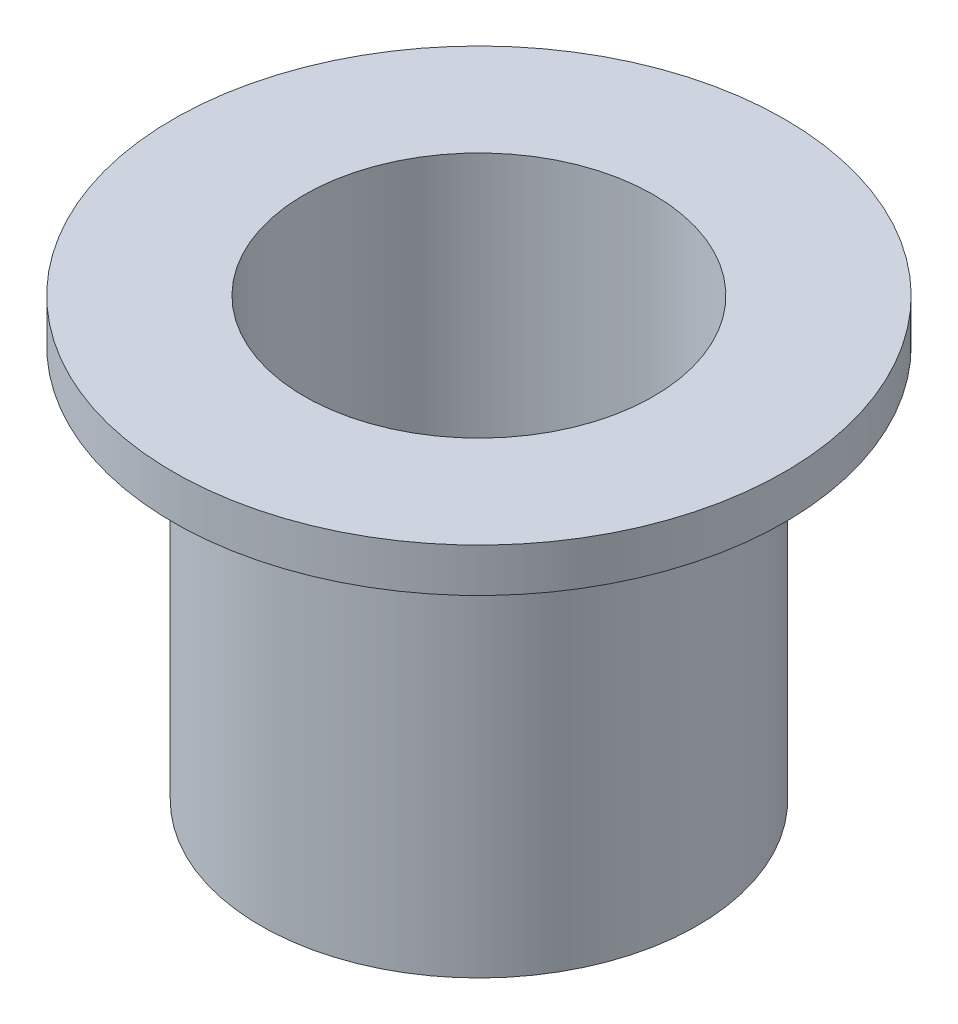
ISO-10303-21;
HEADER;
FILE_DESCRIPTION(('STEP AP214'),'2;1');
FILE_NAME('part.step','',(''),(''),'','','');
FILE_SCHEMA(('AUTOMOTIVE_DESIGN { 1 0 10303 214 1 1 1 1 }'));
ENDSEC;
DATA;
#1=APPLICATION_CONTEXT('core data for automotive mechanical design processes');
#2=APPLICATION_PROTOCOL_DEFINITION('international standard','automotive_design',2000,#1);
#3=PRODUCT_CONTEXT('',#1,'mechanical');
#4=PRODUCT('Part','Part','',(#3));
#5=PRODUCT_RELATED_PRODUCT_CATEGORY('part','',(#4));
#6=PRODUCT_DEFINITION_FORMATION('','',#4);
#7=PRODUCT_DEFINITION_CONTEXT('part definition',#1,'design');
#8=PRODUCT_DEFINITION('design','',#6,#7);
#9=PRODUCT_DEFINITION_SHAPE('','',#8);
#10=(LENGTH_UNIT() NAMED_UNIT(*) SI_UNIT(.MILLI.,.METRE.));
#11=(NAMED_UNIT(*) PLANE_ANGLE_UNIT() SI_UNIT($,.RADIAN.));
#12=(NAMED_UNIT(*) SI_UNIT($,.STERADIAN.) SOLID_ANGLE_UNIT());
#13=UNCERTAINTY_MEASURE_WITH_UNIT(LENGTH_MEASURE(1.E-05),#10,'distance_accuracy_value','');
#14=(GEOMETRIC_REPRESENTATION_CONTEXT(3) GLOBAL_UNCERTAINTY_ASSIGNED_CONTEXT((#13)) GLOBAL_UNIT_ASSIGNED_CONTEXT((#10,
#11,#12)) REPRESENTATION_CONTEXT('',''));
#15=CARTESIAN_POINT('',(0.,0.,0.));
#16=DIRECTION('',(0.,0.,1.));
#17=DIRECTION('',(1.,0.,0.));
#18=AXIS2_PLACEMENT_3D('',#15,#16,#17);
#19=CARTESIAN_POINT('',(-15.875,-2.05441176470587,0.));
#20=DIRECTION('',(0.,1.,0.));
#21=DIRECTION('',(0.,0.,1.));
#22=AXIS2_PLACEMENT_3D('',#19,#20,#21);
#23=PLANE('',#22);
#24=CARTESIAN_POINT('',(0.,-2.05441176470587,0.));
#25=DIRECTION('',(0.,-1.,0.));
#26=DIRECTION('',(0.,0.,-1.));
#27=AXIS2_PLACEMENT_3D('',#24,#25,#26);
#28=CIRCLE('',#27,12.7);
#29=CARTESIAN_POINT('',(0.,-2.05441176470587,-12.7));
#30=VERTEX_POINT('',#29);
#31=EDGE_CURVE('E10',#30,#30,#28,.T.);
#32=ORIENTED_EDGE('',*,*,#31,.F.);
#33=EDGE_LOOP('',(#32));
#34=FACE_BOUND('',#33,.T.);
#35=CARTESIAN_POINT('',(0.,-2.05441176470587,0.));
#36=DIRECTION('',(0.,-1.,0.));
#37=DIRECTION('',(0.,0.,-1.));
#38=AXIS2_PLACEMENT_3D('',#35,#36,#37);
#39=CIRCLE('',#38,15.875);
#40=CARTESIAN_POINT('',(0.,-2.05441176470587,-15.875));
#41=VERTEX_POINT('',#40);
#42=EDGE_CURVE('E53',#41,#41,#39,.T.);
#43=ORIENTED_EDGE('',*,*,#42,.T.);
#44=EDGE_LOOP('',(#43));
#45=FACE_BOUND('',#44,.T.);
#46=ADVANCED_FACE('F31',(#34,#45),#23,.F.);
#47=CARTESIAN_POINT('',(0.,0.,0.));
#48=DIRECTION('',(0.,-1.,0.));
#49=DIRECTION('',(0.,0.,-1.));
#50=AXIS2_PLACEMENT_3D('',#47,#48,#49);
#51=CYLINDRICAL_SURFACE('',#50,12.7);
#52=CARTESIAN_POINT('',(0.,29.6955882352941,0.));
#53=DIRECTION('',(0.,-1.,0.));
#54=DIRECTION('',(0.,0.,-1.));
#55=AXIS2_PLACEMENT_3D('',#52,#53,#54);
#56=CIRCLE('',#55,12.7);
#57=CARTESIAN_POINT('',(0.,29.6955882352941,-12.7));
#58=VERTEX_POINT('',#57);
#59=EDGE_CURVE('E37',#58,#58,#56,.T.);
#60=ORIENTED_EDGE('',*,*,#59,.F.);
#61=EDGE_LOOP('',(#60));
#62=FACE_BOUND('',#61,.T.);
#63=ORIENTED_EDGE('',*,*,#31,.T.);
#64=EDGE_LOOP('',(#63));
#65=FACE_BOUND('',#64,.T.);
#66=ADVANCED_FACE('F78',(#62,#65),#51,.F.);
#67=CARTESIAN_POINT('',(-12.7,29.6955882352941,0.));
#68=DIRECTION('',(0.,-1.,0.));
#69=DIRECTION('',(0.,0.,-1.));
#70=AXIS2_PLACEMENT_3D('',#67,#68,#69);
#71=PLANE('',#70);
#72=CARTESIAN_POINT('',(0.,29.6955882352941,0.));
#73=DIRECTION('',(0.,-1.,0.));
#74=DIRECTION('',(0.,0.,-1.));
#75=AXIS2_PLACEMENT_3D('',#72,#73,#74);
#76=CIRCLE('',#75,22.225);
#77=CARTESIAN_POINT('',(0.,29.6955882352941,-22.225));
#78=VERTEX_POINT('',#77);
#79=EDGE_CURVE('E41',#78,#78,#76,.T.);
#80=ORIENTED_EDGE('',*,*,#79,.F.);
#81=EDGE_LOOP('',(#80));
#82=FACE_BOUND('',#81,.T.);
#83=ORIENTED_EDGE('',*,*,#59,.T.);
#84=EDGE_LOOP('',(#83));
#85=FACE_BOUND('',#84,.T.);
#86=ADVANCED_FACE('F73',(#82,#85),#71,.F.);
#87=CARTESIAN_POINT('',(0.,0.,0.));
#88=DIRECTION('',(0.,-1.,0.));
#89=DIRECTION('',(0.,0.,-1.));
#90=AXIS2_PLACEMENT_3D('',#87,#88,#89);
#91=CYLINDRICAL_SURFACE('',#90,22.225);
#92=CARTESIAN_POINT('',(0.,26.5205882352941,0.));
#93=DIRECTION('',(0.,-1.,0.));
#94=DIRECTION('',(0.,0.,-1.));
#95=AXIS2_PLACEMENT_3D('',#92,#93,#94);
#96=CIRCLE('',#95,22.225);
#97=CARTESIAN_POINT('',(0.,26.5205882352941,-22.225));
#98=VERTEX_POINT('',#97);
#99=EDGE_CURVE('E45',#98,#98,#96,.T.);
#100=ORIENTED_EDGE('',*,*,#99,.F.);
#101=EDGE_LOOP('',(#100));
#102=FACE_BOUND('',#101,.T.);
#103=ORIENTED_EDGE('',*,*,#79,.T.);
#104=EDGE_LOOP('',(#103));
#105=FACE_BOUND('',#104,.T.);
#106=ADVANCED_FACE('F67',(#102,#105),#91,.T.);
#107=CARTESIAN_POINT('',(-22.225,26.5205882352941,0.));
#108=DIRECTION('',(0.,1.,0.));
#109=DIRECTION('',(0.,0.,1.));
#110=AXIS2_PLACEMENT_3D('',#107,#108,#109);
#111=PLANE('',#110);
#112=CARTESIAN_POINT('',(0.,26.5205882352941,0.));
#113=DIRECTION('',(0.,-1.,0.));
#114=DIRECTION('',(0.,0.,-1.));
#115=AXIS2_PLACEMENT_3D('',#112,#113,#114);
#116=CIRCLE('',#115,15.875);
#117=CARTESIAN_POINT('',(0.,26.5205882352941,-15.875));
#118=VERTEX_POINT('',#117);
#119=EDGE_CURVE('E50',#118,#118,#116,.T.);
#120=ORIENTED_EDGE('',*,*,#119,.F.);
#121=EDGE_LOOP('',(#120));
#122=FACE_BOUND('',#121,.T.);
#123=ORIENTED_EDGE('',*,*,#99,.T.);
#124=EDGE_LOOP('',(#123));
#125=FACE_BOUND('',#124,.T.);
#126=ADVANCED_FACE('F61',(#122,#125),#111,.F.);
#127=CARTESIAN_POINT('',(0.,0.,0.));
#128=DIRECTION('',(0.,-1.,0.));
#129=DIRECTION('',(0.,0.,-1.));
#130=AXIS2_PLACEMENT_3D('',#127,#128,#129);
#131=CYLINDRICAL_SURFACE('',#130,15.875);
#132=ORIENTED_EDGE('',*,*,#42,.F.);
#133=EDGE_LOOP('',(#132));
#134=FACE_BOUND('',#133,.T.);
#135=ORIENTED_EDGE('',*,*,#119,.T.);
#136=EDGE_LOOP('',(#135));
#137=FACE_BOUND('',#136,.T.);
#138=ADVANCED_FACE('F58',(#134,#137),#131,.T.);
#139=CLOSED_SHELL('',(#46,#66,#86,#106,#126,#138));
#140=MANIFOLD_SOLID_BREP('B2',#139);
#141=ADVANCED_BREP_SHAPE_REPRESENTATION('',(#18,#140),#14);
#142=SHAPE_DEFINITION_REPRESENTATION(#9,#141);
ENDSEC;
END-ISO-10303-21;
